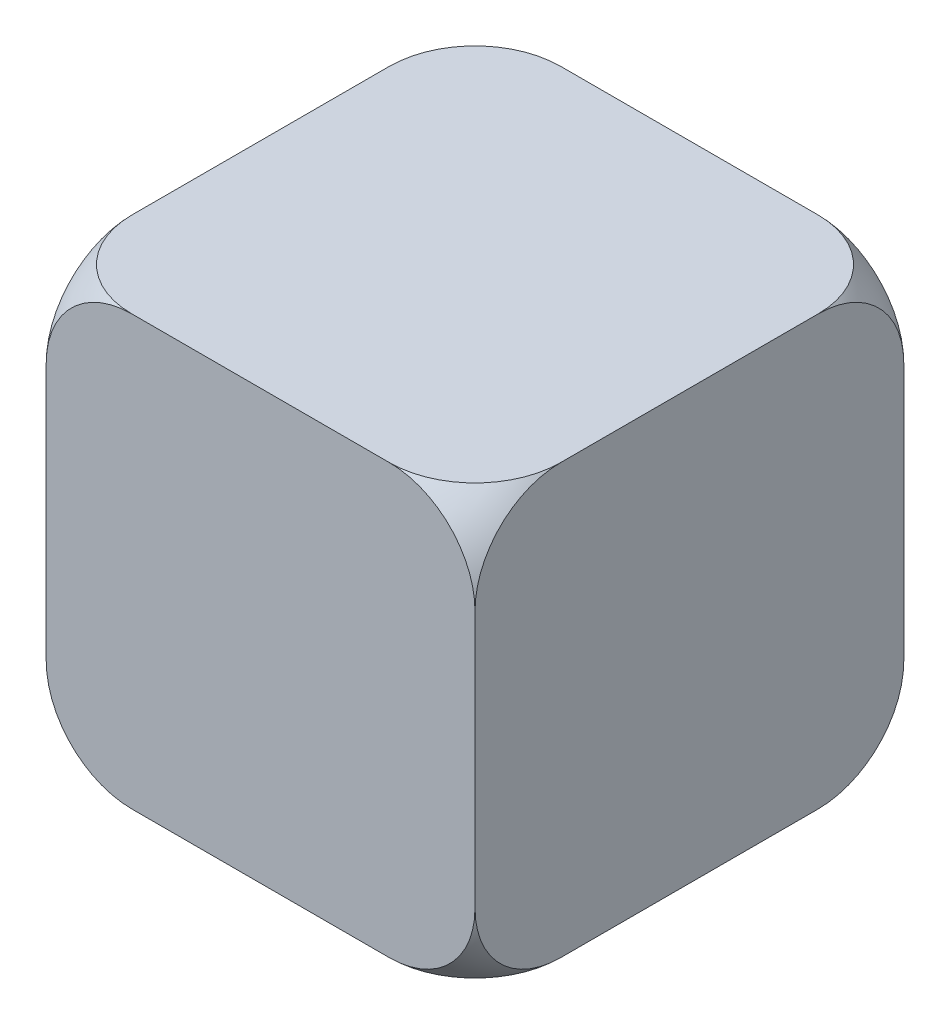
ISO-10303-21;
HEADER;
FILE_DESCRIPTION(('STEP AP214'),'2;1');
FILE_NAME('part.step','',(''),(''),'','','');
FILE_SCHEMA(('AUTOMOTIVE_DESIGN { 1 0 10303 214 1 1 1 1 }'));
ENDSEC;
DATA;
#1=APPLICATION_CONTEXT('core data for automotive mechanical design processes');
#2=APPLICATION_PROTOCOL_DEFINITION('international standard','automotive_design',2000,#1);
#3=PRODUCT_CONTEXT('',#1,'mechanical');
#4=PRODUCT('Part','Part','',(#3));
#5=PRODUCT_RELATED_PRODUCT_CATEGORY('part','',(#4));
#6=PRODUCT_DEFINITION_FORMATION('','',#4);
#7=PRODUCT_DEFINITION_CONTEXT('part definition',#1,'design');
#8=PRODUCT_DEFINITION('design','',#6,#7);
#9=PRODUCT_DEFINITION_SHAPE('','',#8);
#10=(LENGTH_UNIT() NAMED_UNIT(*) SI_UNIT(.MILLI.,.METRE.));
#11=(NAMED_UNIT(*) PLANE_ANGLE_UNIT() SI_UNIT($,.RADIAN.));
#12=(NAMED_UNIT(*) SI_UNIT($,.STERADIAN.) SOLID_ANGLE_UNIT());
#13=UNCERTAINTY_MEASURE_WITH_UNIT(LENGTH_MEASURE(1.E-05),#10,'distance_accuracy_value','');
#14=(GEOMETRIC_REPRESENTATION_CONTEXT(3) GLOBAL_UNCERTAINTY_ASSIGNED_CONTEXT((#13)) GLOBAL_UNIT_ASSIGNED_CONTEXT((#10,
#11,#12)) REPRESENTATION_CONTEXT('',''));
#15=CARTESIAN_POINT('',(0.,0.,0.));
#16=DIRECTION('',(0.,0.,1.));
#17=DIRECTION('',(1.,0.,0.));
#18=AXIS2_PLACEMENT_3D('',#15,#16,#17);
#19=CARTESIAN_POINT('',(0.,0.,-0.828427124746189));
#20=DIRECTION('',(-1.,0.,0.));
#21=DIRECTION('',(0.,-1.,0.));
#22=AXIS2_PLACEMENT_3D('',#19,#20,#21);
#23=PLANE('',#22);
#24=DIRECTION('',(0.,-1.,0.));
#25=VECTOR('',#24,1.);
#26=CARTESIAN_POINT('',(0.,8.,0.));
#27=LINE('',#26,#25);
#28=CARTESIAN_POINT('',(0.,8.,0.));
#29=VERTEX_POINT('',#28);
#30=CARTESIAN_POINT('',(0.,1.99999999999999,0.));
#31=VERTEX_POINT('',#30);
#32=EDGE_CURVE('E135',#29,#31,#27,.T.);
#33=ORIENTED_EDGE('',*,*,#32,.T.);
#34=CARTESIAN_POINT('',(0.,2.,2.));
#35=DIRECTION('',(-1.,0.,0.));
#36=DIRECTION('',(0.,-1.,0.));
#37=AXIS2_PLACEMENT_3D('',#34,#35,#36);
#38=CIRCLE('',#37,2.);
#39=CARTESIAN_POINT('',(0.,0.,2.));
#40=VERTEX_POINT('',#39);
#41=EDGE_CURVE('E41',#31,#40,#38,.T.);
#42=ORIENTED_EDGE('',*,*,#41,.T.);
#43=DIRECTION('',(0.,0.,-1.));
#44=VECTOR('',#43,1.);
#45=CARTESIAN_POINT('',(0.,0.,8.));
#46=LINE('',#45,#44);
#47=CARTESIAN_POINT('',(0.,0.,8.));
#48=VERTEX_POINT('',#47);
#49=EDGE_CURVE('E48',#48,#40,#46,.T.);
#50=ORIENTED_EDGE('',*,*,#49,.F.);
#51=CARTESIAN_POINT('',(0.,2.,8.));
#52=DIRECTION('',(-1.,0.,0.));
#53=DIRECTION('',(0.,-1.,0.));
#54=AXIS2_PLACEMENT_3D('',#51,#52,#53);
#55=CIRCLE('',#54,2.);
#56=CARTESIAN_POINT('',(0.,1.99999999999999,10.));
#57=VERTEX_POINT('',#56);
#58=EDGE_CURVE('E109',#48,#57,#55,.T.);
#59=ORIENTED_EDGE('',*,*,#58,.T.);
#60=DIRECTION('',(0.,-1.,0.));
#61=VECTOR('',#60,1.);
#62=CARTESIAN_POINT('',(0.,8.,10.));
#63=LINE('',#62,#61);
#64=CARTESIAN_POINT('',(0.,8.,10.));
#65=VERTEX_POINT('',#64);
#66=EDGE_CURVE('E233',#65,#57,#63,.T.);
#67=ORIENTED_EDGE('',*,*,#66,.F.);
#68=CARTESIAN_POINT('',(0.,8.,8.));
#69=DIRECTION('',(-1.,0.,0.));
#70=DIRECTION('',(0.,-1.,0.));
#71=AXIS2_PLACEMENT_3D('',#68,#69,#70);
#72=CIRCLE('',#71,2.);
#73=CARTESIAN_POINT('',(0.,10.,8.));
#74=VERTEX_POINT('',#73);
#75=EDGE_CURVE('E79',#65,#74,#72,.T.);
#76=ORIENTED_EDGE('',*,*,#75,.T.);
#77=DIRECTION('',(0.,0.,-1.));
#78=VECTOR('',#77,1.);
#79=CARTESIAN_POINT('',(0.,10.,8.));
#80=LINE('',#79,#78);
#81=CARTESIAN_POINT('',(0.,10.,2.));
#82=VERTEX_POINT('',#81);
#83=EDGE_CURVE('E70',#74,#82,#80,.T.);
#84=ORIENTED_EDGE('',*,*,#83,.T.);
#85=CARTESIAN_POINT('',(0.,8.,2.));
#86=DIRECTION('',(-1.,0.,0.));
#87=DIRECTION('',(0.,-1.,0.));
#88=AXIS2_PLACEMENT_3D('',#85,#86,#87);
#89=CIRCLE('',#88,2.);
#90=EDGE_CURVE('E75',#82,#29,#89,.T.);
#91=ORIENTED_EDGE('',*,*,#90,.T.);
#92=EDGE_LOOP('',(#33,#42,#50,#59,#67,#76,#84,#91));
#93=FACE_BOUND('',#92,.T.);
#94=ADVANCED_FACE('F33',(#93),#23,.T.);
#95=CARTESIAN_POINT('',(0.,0.,-0.828427124746189));
#96=DIRECTION('',(0.,-1.,0.));
#97=DIRECTION('',(1.,0.,0.));
#98=AXIS2_PLACEMENT_3D('',#95,#96,#97);
#99=PLANE('',#98);
#100=CARTESIAN_POINT('',(2.,0.,2.));
#101=DIRECTION('',(0.,-1.,0.));
#102=DIRECTION('',(1.,0.,0.));
#103=AXIS2_PLACEMENT_3D('',#100,#101,#102);
#104=CIRCLE('',#103,2.);
#105=CARTESIAN_POINT('',(2.,0.,0.));
#106=VERTEX_POINT('',#105);
#107=EDGE_CURVE('E130',#40,#106,#104,.T.);
#108=ORIENTED_EDGE('',*,*,#107,.T.);
#109=DIRECTION('',(-1.,0.,0.));
#110=VECTOR('',#109,1.);
#111=CARTESIAN_POINT('',(8.,0.,0.));
#112=LINE('',#111,#110);
#113=CARTESIAN_POINT('',(8.,0.,0.));
#114=VERTEX_POINT('',#113);
#115=EDGE_CURVE('E143',#114,#106,#112,.T.);
#116=ORIENTED_EDGE('',*,*,#115,.F.);
#117=CARTESIAN_POINT('',(8.,0.,2.));
#118=DIRECTION('',(0.,-1.,0.));
#119=DIRECTION('',(1.,0.,0.));
#120=AXIS2_PLACEMENT_3D('',#117,#118,#119);
#121=CIRCLE('',#120,2.);
#122=CARTESIAN_POINT('',(10.,0.,2.));
#123=VERTEX_POINT('',#122);
#124=EDGE_CURVE('E122',#114,#123,#121,.T.);
#125=ORIENTED_EDGE('',*,*,#124,.T.);
#126=DIRECTION('',(0.,0.,-1.));
#127=VECTOR('',#126,1.);
#128=CARTESIAN_POINT('',(9.99999999999999,0.,8.));
#129=LINE('',#128,#127);
#130=CARTESIAN_POINT('',(9.99999999999999,0.,8.));
#131=VERTEX_POINT('',#130);
#132=EDGE_CURVE('E56',#131,#123,#129,.T.);
#133=ORIENTED_EDGE('',*,*,#132,.F.);
#134=CARTESIAN_POINT('',(8.,0.,8.));
#135=DIRECTION('',(0.,-1.,0.));
#136=DIRECTION('',(1.,0.,0.));
#137=AXIS2_PLACEMENT_3D('',#134,#135,#136);
#138=CIRCLE('',#137,2.);
#139=CARTESIAN_POINT('',(8.,0.,10.));
#140=VERTEX_POINT('',#139);
#141=EDGE_CURVE('E117',#131,#140,#138,.T.);
#142=ORIENTED_EDGE('',*,*,#141,.T.);
#143=DIRECTION('',(-1.,0.,0.));
#144=VECTOR('',#143,1.);
#145=CARTESIAN_POINT('',(8.,0.,10.));
#146=LINE('',#145,#144);
#147=CARTESIAN_POINT('',(2.,0.,10.));
#148=VERTEX_POINT('',#147);
#149=EDGE_CURVE('E192',#140,#148,#146,.T.);
#150=ORIENTED_EDGE('',*,*,#149,.T.);
#151=CARTESIAN_POINT('',(2.,0.,8.));
#152=DIRECTION('',(0.,-1.,0.));
#153=DIRECTION('',(1.,0.,0.));
#154=AXIS2_PLACEMENT_3D('',#151,#152,#153);
#155=CIRCLE('',#154,2.);
#156=EDGE_CURVE('E107',#148,#48,#155,.T.);
#157=ORIENTED_EDGE('',*,*,#156,.T.);
#158=ORIENTED_EDGE('',*,*,#49,.T.);
#159=EDGE_LOOP('',(#108,#116,#125,#133,#142,#150,#157,#158));
#160=FACE_BOUND('',#159,.T.);
#161=ADVANCED_FACE('F140',(#160),#99,.T.);
#162=CARTESIAN_POINT('',(2.,2.,2.));
#163=DIRECTION('',(1.,0.,0.));
#164=DIRECTION('',(0.,-1.,0.));
#165=AXIS2_PLACEMENT_3D('',#162,#163,#164);
#166=SPHERICAL_SURFACE('',#165,2.82842712474619);
#167=ORIENTED_EDGE('',*,*,#41,.F.);
#168=CARTESIAN_POINT('',(2.,2.,0.));
#169=DIRECTION('',(0.,0.,1.));
#170=DIRECTION('',(0.,-1.,0.));
#171=AXIS2_PLACEMENT_3D('',#168,#169,#170);
#172=CIRCLE('',#171,2.);
#173=EDGE_CURVE('E11',#31,#106,#172,.T.);
#174=ORIENTED_EDGE('',*,*,#173,.T.);
#175=ORIENTED_EDGE('',*,*,#107,.F.);
#176=EDGE_LOOP('',(#167,#174,#175));
#177=FACE_BOUND('',#176,.T.);
#178=ADVANCED_FACE('F35',(#177),#166,.T.);
#179=CARTESIAN_POINT('',(20.,0.,0.));
#180=DIRECTION('',(0.,0.,1.));
#181=DIRECTION('',(0.,-1.,0.));
#182=AXIS2_PLACEMENT_3D('',#179,#180,#181);
#183=PLANE('',#182);
#184=ORIENTED_EDGE('',*,*,#173,.F.);
#185=ORIENTED_EDGE('',*,*,#32,.F.);
#186=CARTESIAN_POINT('',(2.,8.,0.));
#187=DIRECTION('',(0.,0.,1.));
#188=DIRECTION('',(0.,-1.,0.));
#189=AXIS2_PLACEMENT_3D('',#186,#187,#188);
#190=CIRCLE('',#189,2.);
#191=CARTESIAN_POINT('',(2.,10.,0.));
#192=VERTEX_POINT('',#191);
#193=EDGE_CURVE('E99',#192,#29,#190,.T.);
#194=ORIENTED_EDGE('',*,*,#193,.F.);
#195=DIRECTION('',(-1.,0.,0.));
#196=VECTOR('',#195,1.);
#197=CARTESIAN_POINT('',(8.,10.,0.));
#198=LINE('',#197,#196);
#199=CARTESIAN_POINT('',(8.,10.,0.));
#200=VERTEX_POINT('',#199);
#201=EDGE_CURVE('E92',#200,#192,#198,.T.);
#202=ORIENTED_EDGE('',*,*,#201,.F.);
#203=CARTESIAN_POINT('',(8.,8.,0.));
#204=DIRECTION('',(0.,0.,1.));
#205=DIRECTION('',(0.,-1.,0.));
#206=AXIS2_PLACEMENT_3D('',#203,#204,#205);
#207=CIRCLE('',#206,2.);
#208=CARTESIAN_POINT('',(10.,8.,0.));
#209=VERTEX_POINT('',#208);
#210=EDGE_CURVE('E225',#209,#200,#207,.T.);
#211=ORIENTED_EDGE('',*,*,#210,.F.);
#212=DIRECTION('',(0.,-1.,0.));
#213=VECTOR('',#212,1.);
#214=CARTESIAN_POINT('',(10.,8.,0.));
#215=LINE('',#214,#213);
#216=CARTESIAN_POINT('',(10.,2.,0.));
#217=VERTEX_POINT('',#216);
#218=EDGE_CURVE('E208',#209,#217,#215,.T.);
#219=ORIENTED_EDGE('',*,*,#218,.T.);
#220=CARTESIAN_POINT('',(8.,2.,0.));
#221=DIRECTION('',(0.,0.,1.));
#222=DIRECTION('',(0.,-1.,0.));
#223=AXIS2_PLACEMENT_3D('',#220,#221,#222);
#224=CIRCLE('',#223,2.);
#225=EDGE_CURVE('E124',#114,#217,#224,.T.);
#226=ORIENTED_EDGE('',*,*,#225,.F.);
#227=ORIENTED_EDGE('',*,*,#115,.T.);
#228=EDGE_LOOP('',(#184,#185,#194,#202,#211,#219,#226,#227));
#229=FACE_BOUND('',#228,.T.);
#230=ADVANCED_FACE('F236',(#229),#183,.F.);
#231=CARTESIAN_POINT('',(9.99999999999999,10.,8.));
#232=DIRECTION('',(-1.,0.,0.));
#233=DIRECTION('',(0.,0.,1.));
#234=AXIS2_PLACEMENT_3D('',#231,#232,#233);
#235=PLANE('',#234);
#236=CARTESIAN_POINT('',(10.,8.,8.));
#237=DIRECTION('',(1.,0.,0.));
#238=DIRECTION('',(0.,1.,0.));
#239=AXIS2_PLACEMENT_3D('',#236,#237,#238);
#240=CIRCLE('',#239,2.);
#241=CARTESIAN_POINT('',(9.99999999999999,10.,8.));
#242=VERTEX_POINT('',#241);
#243=CARTESIAN_POINT('',(10.,8.,9.99999999999999));
#244=VERTEX_POINT('',#243);
#245=EDGE_CURVE('E213',#242,#244,#240,.T.);
#246=ORIENTED_EDGE('',*,*,#245,.T.);
#247=DIRECTION('',(0.,-1.,0.));
#248=VECTOR('',#247,1.);
#249=CARTESIAN_POINT('',(10.,8.,10.));
#250=LINE('',#249,#248);
#251=CARTESIAN_POINT('',(10.,2.,10.));
#252=VERTEX_POINT('',#251);
#253=EDGE_CURVE('E188',#244,#252,#250,.T.);
#254=ORIENTED_EDGE('',*,*,#253,.T.);
#255=CARTESIAN_POINT('',(10.,2.,8.));
#256=DIRECTION('',(1.,0.,0.));
#257=DIRECTION('',(0.,1.,0.));
#258=AXIS2_PLACEMENT_3D('',#255,#256,#257);
#259=CIRCLE('',#258,2.);
#260=EDGE_CURVE('E115',#252,#131,#259,.T.);
#261=ORIENTED_EDGE('',*,*,#260,.T.);
#262=ORIENTED_EDGE('',*,*,#132,.T.);
#263=CARTESIAN_POINT('',(10.,2.,2.));
#264=DIRECTION('',(1.,0.,0.));
#265=DIRECTION('',(0.,1.,0.));
#266=AXIS2_PLACEMENT_3D('',#263,#264,#265);
#267=CIRCLE('',#266,2.);
#268=EDGE_CURVE('E119',#123,#217,#267,.T.);
#269=ORIENTED_EDGE('',*,*,#268,.T.);
#270=ORIENTED_EDGE('',*,*,#218,.F.);
#271=CARTESIAN_POINT('',(10.,8.,2.));
#272=DIRECTION('',(1.,0.,0.));
#273=DIRECTION('',(0.,1.,0.));
#274=AXIS2_PLACEMENT_3D('',#271,#272,#273);
#275=CIRCLE('',#274,2.);
#276=CARTESIAN_POINT('',(9.99999999999999,10.,2.));
#277=VERTEX_POINT('',#276);
#278=EDGE_CURVE('E217',#209,#277,#275,.T.);
#279=ORIENTED_EDGE('',*,*,#278,.T.);
#280=DIRECTION('',(0.,0.,-1.));
#281=VECTOR('',#280,1.);
#282=CARTESIAN_POINT('',(9.99999999999999,10.,8.));
#283=LINE('',#282,#281);
#284=EDGE_CURVE('E83',#242,#277,#283,.T.);
#285=ORIENTED_EDGE('',*,*,#284,.F.);
#286=EDGE_LOOP('',(#246,#254,#261,#262,#269,#270,#279,#285));
#287=FACE_BOUND('',#286,.T.);
#288=ADVANCED_FACE('F183',(#287),#235,.F.);
#289=CARTESIAN_POINT('',(9.99999999999999,10.,8.));
#290=DIRECTION('',(0.,-1.,0.));
#291=DIRECTION('',(0.,0.,-1.));
#292=AXIS2_PLACEMENT_3D('',#289,#290,#291);
#293=PLANE('',#292);
#294=CARTESIAN_POINT('',(8.,10.,2.));
#295=DIRECTION('',(0.,1.,0.));
#296=DIRECTION('',(-1.,0.,0.));
#297=AXIS2_PLACEMENT_3D('',#294,#295,#296);
#298=CIRCLE('',#297,2.);
#299=EDGE_CURVE('E220',#277,#200,#298,.T.);
#300=ORIENTED_EDGE('',*,*,#299,.T.);
#301=ORIENTED_EDGE('',*,*,#201,.T.);
#302=CARTESIAN_POINT('',(2.,10.,2.));
#303=DIRECTION('',(0.,1.,0.));
#304=DIRECTION('',(0.,0.,1.));
#305=AXIS2_PLACEMENT_3D('',#302,#303,#304);
#306=CIRCLE('',#305,2.);
#307=EDGE_CURVE('E87',#192,#82,#306,.T.);
#308=ORIENTED_EDGE('',*,*,#307,.T.);
#309=ORIENTED_EDGE('',*,*,#83,.F.);
#310=CARTESIAN_POINT('',(2.,10.,8.));
#311=DIRECTION('',(0.,1.,0.));
#312=DIRECTION('',(0.,0.,1.));
#313=AXIS2_PLACEMENT_3D('',#310,#311,#312);
#314=CIRCLE('',#313,2.);
#315=CARTESIAN_POINT('',(2.,10.,10.));
#316=VERTEX_POINT('',#315);
#317=EDGE_CURVE('E96',#74,#316,#314,.T.);
#318=ORIENTED_EDGE('',*,*,#317,.T.);
#319=DIRECTION('',(-1.,0.,0.));
#320=VECTOR('',#319,1.);
#321=CARTESIAN_POINT('',(8.,10.,10.));
#322=LINE('',#321,#320);
#323=CARTESIAN_POINT('',(8.,10.,10.));
#324=VERTEX_POINT('',#323);
#325=EDGE_CURVE('E201',#324,#316,#322,.T.);
#326=ORIENTED_EDGE('',*,*,#325,.F.);
#327=CARTESIAN_POINT('',(8.,10.,8.));
#328=DIRECTION('',(0.,1.,0.));
#329=DIRECTION('',(-1.,0.,0.));
#330=AXIS2_PLACEMENT_3D('',#327,#328,#329);
#331=CIRCLE('',#330,2.);
#332=EDGE_CURVE('E204',#324,#242,#331,.T.);
#333=ORIENTED_EDGE('',*,*,#332,.T.);
#334=ORIENTED_EDGE('',*,*,#284,.T.);
#335=EDGE_LOOP('',(#300,#301,#308,#309,#318,#326,#333,#334));
#336=FACE_BOUND('',#335,.T.);
#337=ADVANCED_FACE('F89',(#336),#293,.F.);
#338=CARTESIAN_POINT('',(8.,2.,2.));
#339=DIRECTION('',(1.,0.,0.));
#340=DIRECTION('',(0.,1.,0.));
#341=AXIS2_PLACEMENT_3D('',#338,#339,#340);
#342=SPHERICAL_SURFACE('',#341,2.82842712474619);
#343=ORIENTED_EDGE('',*,*,#124,.F.);
#344=ORIENTED_EDGE('',*,*,#225,.T.);
#345=ORIENTED_EDGE('',*,*,#268,.F.);
#346=EDGE_LOOP('',(#343,#344,#345));
#347=FACE_BOUND('',#346,.T.);
#348=ADVANCED_FACE('F178',(#347),#342,.T.);
#349=CARTESIAN_POINT('',(8.,2.,8.));
#350=DIRECTION('',(1.,0.,0.));
#351=DIRECTION('',(0.,1.,0.));
#352=AXIS2_PLACEMENT_3D('',#349,#350,#351);
#353=SPHERICAL_SURFACE('',#352,2.82842712474619);
#354=ORIENTED_EDGE('',*,*,#260,.F.);
#355=CARTESIAN_POINT('',(8.,2.,10.));
#356=DIRECTION('',(0.,0.,-1.));
#357=DIRECTION('',(-1.,0.,0.));
#358=AXIS2_PLACEMENT_3D('',#355,#356,#357);
#359=CIRCLE('',#358,2.);
#360=EDGE_CURVE('E112',#252,#140,#359,.T.);
#361=ORIENTED_EDGE('',*,*,#360,.T.);
#362=ORIENTED_EDGE('',*,*,#141,.F.);
#363=EDGE_LOOP('',(#354,#361,#362));
#364=FACE_BOUND('',#363,.T.);
#365=ADVANCED_FACE('F190',(#364),#353,.T.);
#366=CARTESIAN_POINT('',(20.,0.,10.));
#367=DIRECTION('',(0.,0.,-1.));
#368=DIRECTION('',(-1.,0.,0.));
#369=AXIS2_PLACEMENT_3D('',#366,#367,#368);
#370=PLANE('',#369);
#371=CARTESIAN_POINT('',(2.,7.99999999999999,9.99999999999999));
#372=DIRECTION('',(0.,0.,-1.));
#373=DIRECTION('',(0.,1.,0.));
#374=AXIS2_PLACEMENT_3D('',#371,#372,#373);
#375=CIRCLE('',#374,2.);
#376=EDGE_CURVE('E228',#65,#316,#375,.T.);
#377=ORIENTED_EDGE('',*,*,#376,.F.);
#378=ORIENTED_EDGE('',*,*,#66,.T.);
#379=CARTESIAN_POINT('',(2.,2.,10.));
#380=DIRECTION('',(0.,0.,-1.));
#381=DIRECTION('',(-1.,0.,0.));
#382=AXIS2_PLACEMENT_3D('',#379,#380,#381);
#383=CIRCLE('',#382,2.);
#384=EDGE_CURVE('E101',#148,#57,#383,.T.);
#385=ORIENTED_EDGE('',*,*,#384,.F.);
#386=ORIENTED_EDGE('',*,*,#149,.F.);
#387=ORIENTED_EDGE('',*,*,#360,.F.);
#388=ORIENTED_EDGE('',*,*,#253,.F.);
#389=CARTESIAN_POINT('',(8.,7.99999999999999,9.99999999999999));
#390=DIRECTION('',(0.,0.,-1.));
#391=DIRECTION('',(0.,1.,0.));
#392=AXIS2_PLACEMENT_3D('',#389,#390,#391);
#393=CIRCLE('',#392,2.);
#394=EDGE_CURVE('E210',#324,#244,#393,.T.);
#395=ORIENTED_EDGE('',*,*,#394,.F.);
#396=ORIENTED_EDGE('',*,*,#325,.T.);
#397=EDGE_LOOP('',(#377,#378,#385,#386,#387,#388,#395,#396));
#398=FACE_BOUND('',#397,.T.);
#399=ADVANCED_FACE('F211',(#398),#370,.F.);
#400=CARTESIAN_POINT('',(2.,2.,8.));
#401=DIRECTION('',(1.,0.,0.));
#402=DIRECTION('',(0.,-1.,0.));
#403=AXIS2_PLACEMENT_3D('',#400,#401,#402);
#404=SPHERICAL_SURFACE('',#403,2.82842712474619);
#405=ORIENTED_EDGE('',*,*,#156,.F.);
#406=ORIENTED_EDGE('',*,*,#384,.T.);
#407=ORIENTED_EDGE('',*,*,#58,.F.);
#408=EDGE_LOOP('',(#405,#406,#407));
#409=FACE_BOUND('',#408,.T.);
#410=ADVANCED_FACE('F274',(#409),#404,.T.);
#411=CARTESIAN_POINT('',(2.,8.,2.));
#412=DIRECTION('',(1.,0.,0.));
#413=DIRECTION('',(0.,-1.,0.));
#414=AXIS2_PLACEMENT_3D('',#411,#412,#413);
#415=SPHERICAL_SURFACE('',#414,2.82842712474619);
#416=ORIENTED_EDGE('',*,*,#307,.F.);
#417=ORIENTED_EDGE('',*,*,#193,.T.);
#418=ORIENTED_EDGE('',*,*,#90,.F.);
#419=EDGE_LOOP('',(#416,#417,#418));
#420=FACE_BOUND('',#419,.T.);
#421=ADVANCED_FACE('F98',(#420),#415,.T.);
#422=CARTESIAN_POINT('',(2.,8.,8.));
#423=DIRECTION('',(1.,0.,0.));
#424=DIRECTION('',(0.,-1.,0.));
#425=AXIS2_PLACEMENT_3D('',#422,#423,#424);
#426=SPHERICAL_SURFACE('',#425,2.82842712474619);
#427=ORIENTED_EDGE('',*,*,#75,.F.);
#428=ORIENTED_EDGE('',*,*,#376,.T.);
#429=ORIENTED_EDGE('',*,*,#317,.F.);
#430=EDGE_LOOP('',(#427,#428,#429));
#431=FACE_BOUND('',#430,.T.);
#432=ADVANCED_FACE('F231',(#431),#426,.T.);
#433=CARTESIAN_POINT('',(8.,8.,2.));
#434=DIRECTION('',(1.,0.,0.));
#435=DIRECTION('',(0.,1.,0.));
#436=AXIS2_PLACEMENT_3D('',#433,#434,#435);
#437=SPHERICAL_SURFACE('',#436,2.82842712474619);
#438=ORIENTED_EDGE('',*,*,#278,.F.);
#439=ORIENTED_EDGE('',*,*,#210,.T.);
#440=ORIENTED_EDGE('',*,*,#299,.F.);
#441=EDGE_LOOP('',(#438,#439,#440));
#442=FACE_BOUND('',#441,.T.);
#443=ADVANCED_FACE('F247',(#442),#437,.T.);
#444=CARTESIAN_POINT('',(8.,8.,8.));
#445=DIRECTION('',(1.,0.,0.));
#446=DIRECTION('',(0.,1.,0.));
#447=AXIS2_PLACEMENT_3D('',#444,#445,#446);
#448=SPHERICAL_SURFACE('',#447,2.82842712474619);
#449=ORIENTED_EDGE('',*,*,#332,.F.);
#450=ORIENTED_EDGE('',*,*,#394,.T.);
#451=ORIENTED_EDGE('',*,*,#245,.F.);
#452=EDGE_LOOP('',(#449,#450,#451));
#453=FACE_BOUND('',#452,.T.);
#454=ADVANCED_FACE('F215',(#453),#448,.T.);
#455=CLOSED_SHELL('',(#94,#161,#178,#230,#288,#337,#348,#365,#399,#410,#421,#432,#443,#454));
#456=MANIFOLD_SOLID_BREP('B2',#455);
#457=ADVANCED_BREP_SHAPE_REPRESENTATION('',(#18,#456),#14);
#458=SHAPE_DEFINITION_REPRESENTATION(#9,#457);
ENDSEC;
END-ISO-10303-21;
